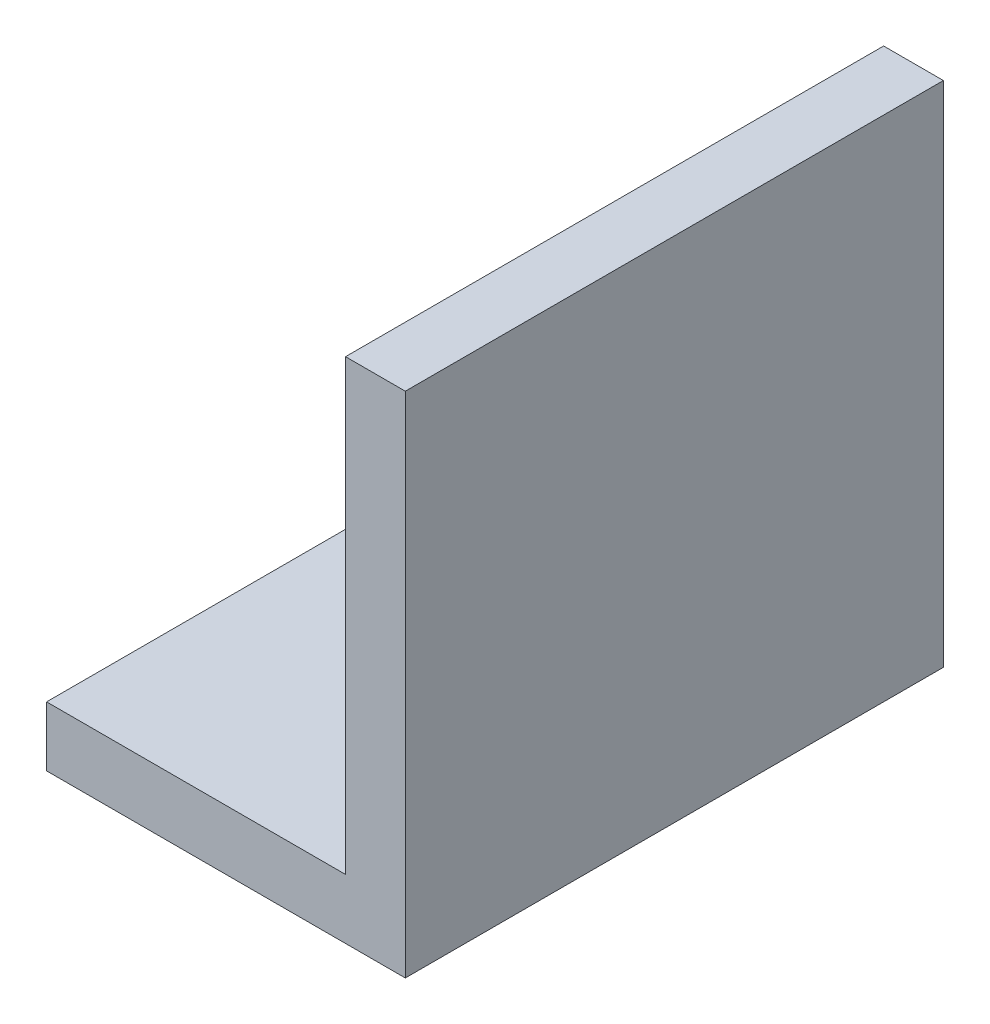
ISO-10303-21;
HEADER;
FILE_DESCRIPTION(('STEP AP214'),'2;1');
FILE_NAME('part.step','',(''),(''),'','','');
FILE_SCHEMA(('AUTOMOTIVE_DESIGN { 1 0 10303 214 1 1 1 1 }'));
ENDSEC;
DATA;
#1=APPLICATION_CONTEXT('core data for automotive mechanical design processes');
#2=APPLICATION_PROTOCOL_DEFINITION('international standard','automotive_design',2000,#1);
#3=PRODUCT_CONTEXT('',#1,'mechanical');
#4=PRODUCT('Part','Part','',(#3));
#5=PRODUCT_RELATED_PRODUCT_CATEGORY('part','',(#4));
#6=PRODUCT_DEFINITION_FORMATION('','',#4);
#7=PRODUCT_DEFINITION_CONTEXT('part definition',#1,'design');
#8=PRODUCT_DEFINITION('design','',#6,#7);
#9=PRODUCT_DEFINITION_SHAPE('','',#8);
#10=(LENGTH_UNIT() NAMED_UNIT(*) SI_UNIT(.MILLI.,.METRE.));
#11=(NAMED_UNIT(*) PLANE_ANGLE_UNIT() SI_UNIT($,.RADIAN.));
#12=(NAMED_UNIT(*) SI_UNIT($,.STERADIAN.) SOLID_ANGLE_UNIT());
#13=UNCERTAINTY_MEASURE_WITH_UNIT(LENGTH_MEASURE(1.E-05),#10,'distance_accuracy_value','');
#14=(GEOMETRIC_REPRESENTATION_CONTEXT(3) GLOBAL_UNCERTAINTY_ASSIGNED_CONTEXT((#13)) GLOBAL_UNIT_ASSIGNED_CONTEXT((#10,
#11,#12)) REPRESENTATION_CONTEXT('',''));
#15=CARTESIAN_POINT('',(0.,0.,0.));
#16=DIRECTION('',(0.,0.,1.));
#17=DIRECTION('',(1.,0.,0.));
#18=AXIS2_PLACEMENT_3D('',#15,#16,#17);
#19=CARTESIAN_POINT('',(2.,0.,18.));
#20=DIRECTION('',(-1.,0.,0.));
#21=DIRECTION('',(0.,0.,1.));
#22=AXIS2_PLACEMENT_3D('',#19,#20,#21);
#23=PLANE('',#22);
#24=DIRECTION('',(0.,1.,0.));
#25=VECTOR('',#24,1.);
#26=CARTESIAN_POINT('',(2.,0.,0.));
#27=LINE('',#26,#25);
#28=CARTESIAN_POINT('',(2.,-2.,0.));
#29=VERTEX_POINT('',#28);
#30=CARTESIAN_POINT('',(2.,15.,0.));
#31=VERTEX_POINT('',#30);
#32=EDGE_CURVE('E116',#29,#31,#27,.T.);
#33=ORIENTED_EDGE('',*,*,#32,.T.);
#34=DIRECTION('',(0.,0.,-1.));
#35=VECTOR('',#34,1.);
#36=CARTESIAN_POINT('',(2.,15.,18.));
#37=LINE('',#36,#35);
#38=CARTESIAN_POINT('',(2.,15.,18.));
#39=VERTEX_POINT('',#38);
#40=EDGE_CURVE('E11',#39,#31,#37,.T.);
#41=ORIENTED_EDGE('',*,*,#40,.F.);
#42=DIRECTION('',(0.,1.,0.));
#43=VECTOR('',#42,1.);
#44=CARTESIAN_POINT('',(2.,0.,18.));
#45=LINE('',#44,#43);
#46=CARTESIAN_POINT('',(2.,-2.,18.));
#47=VERTEX_POINT('',#46);
#48=EDGE_CURVE('E81',#47,#39,#45,.T.);
#49=ORIENTED_EDGE('',*,*,#48,.F.);
#50=DIRECTION('',(0.,0.,-1.));
#51=VECTOR('',#50,1.);
#52=CARTESIAN_POINT('',(2.,-2.,18.));
#53=LINE('',#52,#51);
#54=EDGE_CURVE('E112',#47,#29,#53,.T.);
#55=ORIENTED_EDGE('',*,*,#54,.T.);
#56=EDGE_LOOP('',(#33,#41,#49,#55));
#57=FACE_BOUND('',#56,.T.);
#58=ADVANCED_FACE('F35',(#57),#23,.F.);
#59=CARTESIAN_POINT('',(0.,15.,18.));
#60=DIRECTION('',(0.,1.,0.));
#61=DIRECTION('',(0.,0.,1.));
#62=AXIS2_PLACEMENT_3D('',#59,#60,#61);
#63=PLANE('',#62);
#64=DIRECTION('',(1.,0.,0.));
#65=VECTOR('',#64,1.);
#66=CARTESIAN_POINT('',(0.,15.,0.));
#67=LINE('',#66,#65);
#68=CARTESIAN_POINT('',(0.,15.,0.));
#69=VERTEX_POINT('',#68);
#70=EDGE_CURVE('E119',#69,#31,#67,.T.);
#71=ORIENTED_EDGE('',*,*,#70,.F.);
#72=DIRECTION('',(0.,0.,-1.));
#73=VECTOR('',#72,1.);
#74=CARTESIAN_POINT('',(0.,15.,18.));
#75=LINE('',#74,#73);
#76=CARTESIAN_POINT('',(0.,15.,18.));
#77=VERTEX_POINT('',#76);
#78=EDGE_CURVE('E43',#77,#69,#75,.T.);
#79=ORIENTED_EDGE('',*,*,#78,.F.);
#80=DIRECTION('',(1.,0.,0.));
#81=VECTOR('',#80,1.);
#82=CARTESIAN_POINT('',(0.,15.,18.));
#83=LINE('',#82,#81);
#84=EDGE_CURVE('E205',#77,#39,#83,.T.);
#85=ORIENTED_EDGE('',*,*,#84,.T.);
#86=ORIENTED_EDGE('',*,*,#40,.T.);
#87=EDGE_LOOP('',(#71,#79,#85,#86));
#88=FACE_BOUND('',#87,.T.);
#89=ADVANCED_FACE('F137',(#88),#63,.T.);
#90=CARTESIAN_POINT('',(0.,0.,18.));
#91=DIRECTION('',(-1.,0.,0.));
#92=DIRECTION('',(0.,0.,1.));
#93=AXIS2_PLACEMENT_3D('',#90,#91,#92);
#94=PLANE('',#93);
#95=DIRECTION('',(0.,1.,0.));
#96=VECTOR('',#95,1.);
#97=CARTESIAN_POINT('',(0.,0.,0.));
#98=LINE('',#97,#96);
#99=CARTESIAN_POINT('',(0.,0.,0.));
#100=VERTEX_POINT('',#99);
#101=EDGE_CURVE('E122',#100,#69,#98,.T.);
#102=ORIENTED_EDGE('',*,*,#101,.F.);
#103=DIRECTION('',(0.,0.,-1.));
#104=VECTOR('',#103,1.);
#105=CARTESIAN_POINT('',(0.,0.,18.));
#106=LINE('',#105,#104);
#107=CARTESIAN_POINT('',(0.,0.,18.));
#108=VERTEX_POINT('',#107);
#109=EDGE_CURVE('E102',#108,#100,#106,.T.);
#110=ORIENTED_EDGE('',*,*,#109,.F.);
#111=DIRECTION('',(0.,1.,0.));
#112=VECTOR('',#111,1.);
#113=CARTESIAN_POINT('',(0.,0.,18.));
#114=LINE('',#113,#112);
#115=EDGE_CURVE('E108',#108,#77,#114,.T.);
#116=ORIENTED_EDGE('',*,*,#115,.T.);
#117=ORIENTED_EDGE('',*,*,#78,.T.);
#118=EDGE_LOOP('',(#102,#110,#116,#117));
#119=FACE_BOUND('',#118,.T.);
#120=ADVANCED_FACE('F134',(#119),#94,.T.);
#121=CARTESIAN_POINT('',(0.,0.,18.));
#122=DIRECTION('',(0.,1.,0.));
#123=DIRECTION('',(-1.,0.,0.));
#124=AXIS2_PLACEMENT_3D('',#121,#122,#123);
#125=PLANE('',#124);
#126=DIRECTION('',(1.,0.,0.));
#127=VECTOR('',#126,1.);
#128=CARTESIAN_POINT('',(0.,0.,0.));
#129=LINE('',#128,#127);
#130=CARTESIAN_POINT('',(-10.,0.,0.));
#131=VERTEX_POINT('',#130);
#132=EDGE_CURVE('E97',#131,#100,#129,.T.);
#133=ORIENTED_EDGE('',*,*,#132,.F.);
#134=DIRECTION('',(0.,0.,-1.));
#135=VECTOR('',#134,1.);
#136=CARTESIAN_POINT('',(-10.,0.,18.));
#137=LINE('',#136,#135);
#138=CARTESIAN_POINT('',(-10.,0.,18.));
#139=VERTEX_POINT('',#138);
#140=EDGE_CURVE('E92',#139,#131,#137,.T.);
#141=ORIENTED_EDGE('',*,*,#140,.F.);
#142=DIRECTION('',(1.,0.,0.));
#143=VECTOR('',#142,1.);
#144=CARTESIAN_POINT('',(0.,0.,18.));
#145=LINE('',#144,#143);
#146=EDGE_CURVE('E95',#139,#108,#145,.T.);
#147=ORIENTED_EDGE('',*,*,#146,.T.);
#148=ORIENTED_EDGE('',*,*,#109,.T.);
#149=EDGE_LOOP('',(#133,#141,#147,#148));
#150=FACE_BOUND('',#149,.T.);
#151=ADVANCED_FACE('F94',(#150),#125,.T.);
#152=CARTESIAN_POINT('',(-10.,-2.,18.));
#153=DIRECTION('',(-1.,0.,0.));
#154=DIRECTION('',(0.,0.,1.));
#155=AXIS2_PLACEMENT_3D('',#152,#153,#154);
#156=PLANE('',#155);
#157=DIRECTION('',(0.,1.,0.));
#158=VECTOR('',#157,1.);
#159=CARTESIAN_POINT('',(-10.,-2.,0.));
#160=LINE('',#159,#158);
#161=CARTESIAN_POINT('',(-10.,-2.,0.));
#162=VERTEX_POINT('',#161);
#163=EDGE_CURVE('E126',#162,#131,#160,.T.);
#164=ORIENTED_EDGE('',*,*,#163,.F.);
#165=DIRECTION('',(0.,0.,-1.));
#166=VECTOR('',#165,1.);
#167=CARTESIAN_POINT('',(-10.,-2.,18.));
#168=LINE('',#167,#166);
#169=CARTESIAN_POINT('',(-10.,-2.,18.));
#170=VERTEX_POINT('',#169);
#171=EDGE_CURVE('E72',#170,#162,#168,.T.);
#172=ORIENTED_EDGE('',*,*,#171,.F.);
#173=DIRECTION('',(0.,1.,0.));
#174=VECTOR('',#173,1.);
#175=CARTESIAN_POINT('',(-10.,-2.,18.));
#176=LINE('',#175,#174);
#177=EDGE_CURVE('E106',#170,#139,#176,.T.);
#178=ORIENTED_EDGE('',*,*,#177,.T.);
#179=ORIENTED_EDGE('',*,*,#140,.T.);
#180=EDGE_LOOP('',(#164,#172,#178,#179));
#181=FACE_BOUND('',#180,.T.);
#182=ADVANCED_FACE('F110',(#181),#156,.T.);
#183=CARTESIAN_POINT('',(0.,-2.,18.));
#184=DIRECTION('',(0.,1.,0.));
#185=DIRECTION('',(-1.,0.,0.));
#186=AXIS2_PLACEMENT_3D('',#183,#184,#185);
#187=PLANE('',#186);
#188=DIRECTION('',(1.,0.,0.));
#189=VECTOR('',#188,1.);
#190=CARTESIAN_POINT('',(0.,-2.,0.));
#191=LINE('',#190,#189);
#192=EDGE_CURVE('E75',#162,#29,#191,.T.);
#193=ORIENTED_EDGE('',*,*,#192,.T.);
#194=ORIENTED_EDGE('',*,*,#54,.F.);
#195=DIRECTION('',(1.,0.,0.));
#196=VECTOR('',#195,1.);
#197=CARTESIAN_POINT('',(0.,-2.,18.));
#198=LINE('',#197,#196);
#199=EDGE_CURVE('E51',#170,#47,#198,.T.);
#200=ORIENTED_EDGE('',*,*,#199,.F.);
#201=ORIENTED_EDGE('',*,*,#171,.T.);
#202=EDGE_LOOP('',(#193,#194,#200,#201));
#203=FACE_BOUND('',#202,.T.);
#204=ADVANCED_FACE('F142',(#203),#187,.F.);
#205=CARTESIAN_POINT('',(2.,15.,18.));
#206=DIRECTION('',(0.,0.,-1.));
#207=DIRECTION('',(-1.,0.,0.));
#208=AXIS2_PLACEMENT_3D('',#205,#206,#207);
#209=PLANE('',#208);
#210=ORIENTED_EDGE('',*,*,#48,.T.);
#211=ORIENTED_EDGE('',*,*,#84,.F.);
#212=ORIENTED_EDGE('',*,*,#115,.F.);
#213=ORIENTED_EDGE('',*,*,#146,.F.);
#214=ORIENTED_EDGE('',*,*,#177,.F.);
#215=ORIENTED_EDGE('',*,*,#199,.T.);
#216=EDGE_LOOP('',(#210,#211,#212,#213,#214,#215));
#217=FACE_BOUND('',#216,.T.);
#218=ADVANCED_FACE('F105',(#217),#209,.F.);
#219=CARTESIAN_POINT('',(2.,15.,0.));
#220=DIRECTION('',(0.,0.,-1.));
#221=DIRECTION('',(-1.,0.,0.));
#222=AXIS2_PLACEMENT_3D('',#219,#220,#221);
#223=PLANE('',#222);
#224=ORIENTED_EDGE('',*,*,#32,.F.);
#225=ORIENTED_EDGE('',*,*,#192,.F.);
#226=ORIENTED_EDGE('',*,*,#163,.T.);
#227=ORIENTED_EDGE('',*,*,#132,.T.);
#228=ORIENTED_EDGE('',*,*,#101,.T.);
#229=ORIENTED_EDGE('',*,*,#70,.T.);
#230=EDGE_LOOP('',(#224,#225,#226,#227,#228,#229));
#231=FACE_BOUND('',#230,.T.);
#232=ADVANCED_FACE('F140',(#231),#223,.T.);
#233=CLOSED_SHELL('',(#58,#89,#120,#151,#182,#204,#218,#232));
#234=MANIFOLD_SOLID_BREP('B2',#233);
#235=ADVANCED_BREP_SHAPE_REPRESENTATION('',(#18,#234),#14);
#236=SHAPE_DEFINITION_REPRESENTATION(#9,#235);
ENDSEC;
END-ISO-10303-21;
